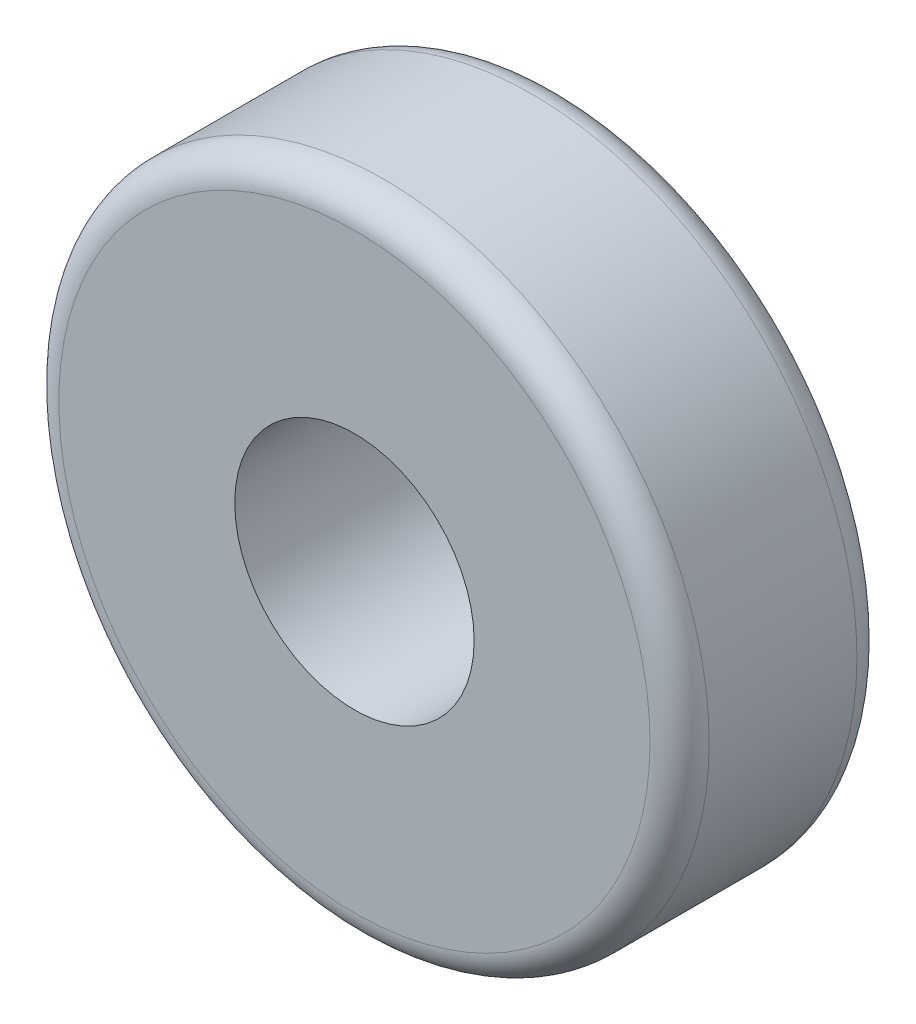
ISO-10303-21;
HEADER;
FILE_DESCRIPTION(('STEP AP214'),'2;1');
FILE_NAME('part.step','',(''),(''),'','','');
FILE_SCHEMA(('AUTOMOTIVE_DESIGN { 1 0 10303 214 1 1 1 1 }'));
ENDSEC;
DATA;
#1=APPLICATION_CONTEXT('core data for automotive mechanical design processes');
#2=APPLICATION_PROTOCOL_DEFINITION('international standard','automotive_design',2000,#1);
#3=PRODUCT_CONTEXT('',#1,'mechanical');
#4=PRODUCT('Part','Part','',(#3));
#5=PRODUCT_RELATED_PRODUCT_CATEGORY('part','',(#4));
#6=PRODUCT_DEFINITION_FORMATION('','',#4);
#7=PRODUCT_DEFINITION_CONTEXT('part definition',#1,'design');
#8=PRODUCT_DEFINITION('design','',#6,#7);
#9=PRODUCT_DEFINITION_SHAPE('','',#8);
#10=(LENGTH_UNIT() NAMED_UNIT(*) SI_UNIT(.MILLI.,.METRE.));
#11=(NAMED_UNIT(*) PLANE_ANGLE_UNIT() SI_UNIT($,.RADIAN.));
#12=(NAMED_UNIT(*) SI_UNIT($,.STERADIAN.) SOLID_ANGLE_UNIT());
#13=UNCERTAINTY_MEASURE_WITH_UNIT(LENGTH_MEASURE(1.E-05),#10,'distance_accuracy_value','');
#14=(GEOMETRIC_REPRESENTATION_CONTEXT(3) GLOBAL_UNCERTAINTY_ASSIGNED_CONTEXT((#13)) GLOBAL_UNIT_ASSIGNED_CONTEXT((#10,
#11,#12)) REPRESENTATION_CONTEXT('',''));
#15=CARTESIAN_POINT('',(0.,0.,0.));
#16=DIRECTION('',(0.,0.,1.));
#17=DIRECTION('',(1.,0.,0.));
#18=AXIS2_PLACEMENT_3D('',#15,#16,#17);
#19=CARTESIAN_POINT('',(0.,0.,7.));
#20=DIRECTION('',(0.,0.,1.));
#21=DIRECTION('',(1.,0.,0.));
#22=AXIS2_PLACEMENT_3D('',#19,#20,#21);
#23=PLANE('',#22);
#24=CARTESIAN_POINT('',(0.,0.,7.));
#25=DIRECTION('',(0.,0.,1.));
#26=DIRECTION('',(1.,0.,0.));
#27=AXIS2_PLACEMENT_3D('',#24,#25,#26);
#28=CIRCLE('',#27,10.);
#29=CARTESIAN_POINT('',(10.,0.,7.));
#30=VERTEX_POINT('',#29);
#31=EDGE_CURVE('E10',#30,#30,#28,.T.);
#32=ORIENTED_EDGE('',*,*,#31,.T.);
#33=EDGE_LOOP('',(#32));
#34=FACE_BOUND('',#33,.T.);
#35=CARTESIAN_POINT('',(0.,0.,7.));
#36=DIRECTION('',(0.,0.,1.));
#37=DIRECTION('',(1.,0.,0.));
#38=AXIS2_PLACEMENT_3D('',#35,#36,#37);
#39=CIRCLE('',#38,4.05);
#40=CARTESIAN_POINT('',(4.05,0.,7.));
#41=VERTEX_POINT('',#40);
#42=EDGE_CURVE('E57',#41,#41,#39,.T.);
#43=ORIENTED_EDGE('',*,*,#42,.F.);
#44=EDGE_LOOP('',(#43));
#45=FACE_BOUND('',#44,.T.);
#46=ADVANCED_FACE('F37',(#34,#45),#23,.T.);
#47=CARTESIAN_POINT('',(0.,0.,0.));
#48=DIRECTION('',(0.,0.,1.));
#49=DIRECTION('',(1.,0.,0.));
#50=AXIS2_PLACEMENT_3D('',#47,#48,#49);
#51=PLANE('',#50);
#52=CARTESIAN_POINT('',(0.,0.,0.));
#53=DIRECTION('',(0.,0.,1.));
#54=DIRECTION('',(1.,0.,0.));
#55=AXIS2_PLACEMENT_3D('',#52,#53,#54);
#56=CIRCLE('',#55,10.);
#57=CARTESIAN_POINT('',(10.,0.,0.));
#58=VERTEX_POINT('',#57);
#59=EDGE_CURVE('E44',#58,#58,#56,.F.);
#60=ORIENTED_EDGE('',*,*,#59,.T.);
#61=EDGE_LOOP('',(#60));
#62=FACE_BOUND('',#61,.T.);
#63=CARTESIAN_POINT('',(0.,0.,0.));
#64=DIRECTION('',(0.,0.,1.));
#65=DIRECTION('',(1.,0.,0.));
#66=AXIS2_PLACEMENT_3D('',#63,#64,#65);
#67=CIRCLE('',#66,4.05);
#68=CARTESIAN_POINT('',(4.05,0.,0.));
#69=VERTEX_POINT('',#68);
#70=EDGE_CURVE('E58',#69,#69,#67,.T.);
#71=ORIENTED_EDGE('',*,*,#70,.T.);
#72=EDGE_LOOP('',(#71));
#73=FACE_BOUND('',#72,.T.);
#74=ADVANCED_FACE('F68',(#62,#73),#51,.F.);
#75=CARTESIAN_POINT('',(0.,0.,7.));
#76=DIRECTION('',(0.,0.,-1.));
#77=DIRECTION('',(-1.,0.,0.));
#78=AXIS2_PLACEMENT_3D('',#75,#76,#77);
#79=CYLINDRICAL_SURFACE('',#78,11.);
#80=CARTESIAN_POINT('',(0.,0.,1.));
#81=DIRECTION('',(0.,0.,1.));
#82=DIRECTION('',(1.,0.,0.));
#83=AXIS2_PLACEMENT_3D('',#80,#81,#82);
#84=CIRCLE('',#83,11.);
#85=CARTESIAN_POINT('',(11.,0.,1.));
#86=VERTEX_POINT('',#85);
#87=EDGE_CURVE('E48',#86,#86,#84,.T.);
#88=ORIENTED_EDGE('',*,*,#87,.T.);
#89=EDGE_LOOP('',(#88));
#90=FACE_BOUND('',#89,.T.);
#91=CARTESIAN_POINT('',(0.,0.,6.));
#92=DIRECTION('',(0.,0.,1.));
#93=DIRECTION('',(1.,0.,0.));
#94=AXIS2_PLACEMENT_3D('',#91,#92,#93);
#95=CIRCLE('',#94,11.);
#96=CARTESIAN_POINT('',(11.,0.,6.));
#97=VERTEX_POINT('',#96);
#98=EDGE_CURVE('E52',#97,#97,#95,.F.);
#99=ORIENTED_EDGE('',*,*,#98,.T.);
#100=EDGE_LOOP('',(#99));
#101=FACE_BOUND('',#100,.T.);
#102=ADVANCED_FACE('F74',(#90,#101),#79,.T.);
#103=CARTESIAN_POINT('',(0.,0.,7.));
#104=DIRECTION('',(0.,0.,-1.));
#105=DIRECTION('',(-1.,0.,0.));
#106=AXIS2_PLACEMENT_3D('',#103,#104,#105);
#107=CYLINDRICAL_SURFACE('',#106,4.05);
#108=ORIENTED_EDGE('',*,*,#42,.T.);
#109=EDGE_LOOP('',(#108));
#110=FACE_BOUND('',#109,.T.);
#111=ORIENTED_EDGE('',*,*,#70,.F.);
#112=EDGE_LOOP('',(#111));
#113=FACE_BOUND('',#112,.T.);
#114=ADVANCED_FACE('F64',(#110,#113),#107,.F.);
#115=CARTESIAN_POINT('',(0.,0.,1.));
#116=DIRECTION('',(0.,0.,1.));
#117=DIRECTION('',(1.,0.,0.));
#118=AXIS2_PLACEMENT_3D('',#115,#116,#117);
#119=TOROIDAL_SURFACE('',#118,10.,1.);
#120=ORIENTED_EDGE('',*,*,#59,.F.);
#121=EDGE_LOOP('',(#120));
#122=FACE_BOUND('',#121,.T.);
#123=ORIENTED_EDGE('',*,*,#87,.F.);
#124=EDGE_LOOP('',(#123));
#125=FACE_BOUND('',#124,.T.);
#126=ADVANCED_FACE('F80',(#122,#125),#119,.T.);
#127=CARTESIAN_POINT('',(0.,0.,6.));
#128=DIRECTION('',(0.,0.,1.));
#129=DIRECTION('',(1.,0.,0.));
#130=AXIS2_PLACEMENT_3D('',#127,#128,#129);
#131=TOROIDAL_SURFACE('',#130,10.,1.);
#132=ORIENTED_EDGE('',*,*,#98,.F.);
#133=EDGE_LOOP('',(#132));
#134=FACE_BOUND('',#133,.T.);
#135=ORIENTED_EDGE('',*,*,#31,.F.);
#136=EDGE_LOOP('',(#135));
#137=FACE_BOUND('',#136,.T.);
#138=ADVANCED_FACE('F39',(#134,#137),#131,.T.);
#139=CLOSED_SHELL('',(#46,#74,#102,#114,#126,#138));
#140=MANIFOLD_SOLID_BREP('B2',#139);
#141=ADVANCED_BREP_SHAPE_REPRESENTATION('',(#18,#140),#14);
#142=SHAPE_DEFINITION_REPRESENTATION(#9,#141);
ENDSEC;
END-ISO-10303-21;
